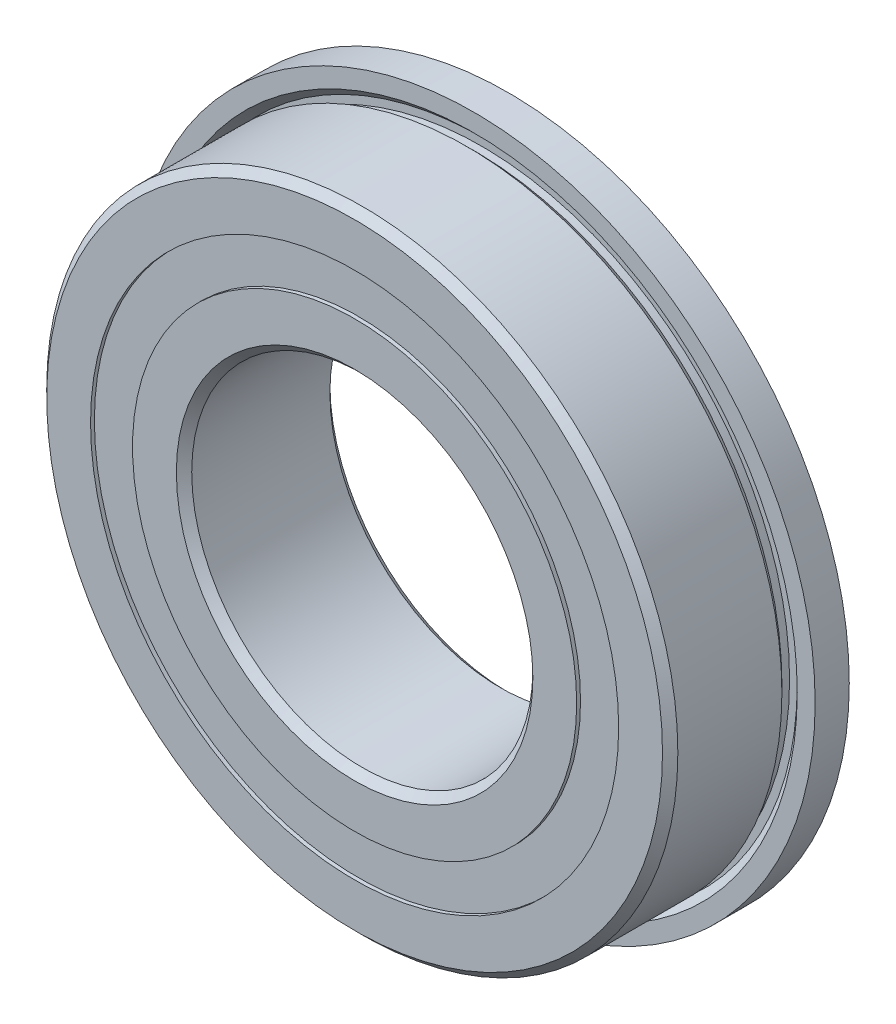
ISO-10303-21;
HEADER;
FILE_DESCRIPTION(('STEP AP214'),'2;1');
FILE_NAME('part.step','',(''),(''),'','','');
FILE_SCHEMA(('AUTOMOTIVE_DESIGN { 1 0 10303 214 1 1 1 1 }'));
ENDSEC;
DATA;
#1=APPLICATION_CONTEXT('core data for automotive mechanical design processes');
#2=APPLICATION_PROTOCOL_DEFINITION('international standard','automotive_design',2000,#1);
#3=PRODUCT_CONTEXT('',#1,'mechanical');
#4=PRODUCT('Part','Part','',(#3));
#5=PRODUCT_RELATED_PRODUCT_CATEGORY('part','',(#4));
#6=PRODUCT_DEFINITION_FORMATION('','',#4);
#7=PRODUCT_DEFINITION_CONTEXT('part definition',#1,'design');
#8=PRODUCT_DEFINITION('design','',#6,#7);
#9=PRODUCT_DEFINITION_SHAPE('','',#8);
#10=(LENGTH_UNIT() NAMED_UNIT(*) SI_UNIT(.MILLI.,.METRE.));
#11=(NAMED_UNIT(*) PLANE_ANGLE_UNIT() SI_UNIT($,.RADIAN.));
#12=(NAMED_UNIT(*) SI_UNIT($,.STERADIAN.) SOLID_ANGLE_UNIT());
#13=UNCERTAINTY_MEASURE_WITH_UNIT(LENGTH_MEASURE(1.E-05),#10,'distance_accuracy_value','');
#14=(GEOMETRIC_REPRESENTATION_CONTEXT(3) GLOBAL_UNCERTAINTY_ASSIGNED_CONTEXT((#13)) GLOBAL_UNIT_ASSIGNED_CONTEXT((#10,
#11,#12)) REPRESENTATION_CONTEXT('',''));
#15=CARTESIAN_POINT('',(0.,0.,0.));
#16=DIRECTION('',(0.,0.,1.));
#17=DIRECTION('',(1.,0.,0.));
#18=AXIS2_PLACEMENT_3D('',#15,#16,#17);
#19=CARTESIAN_POINT('',(0.,15.4807692307692,-4.275));
#20=DIRECTION('',(0.,0.,1.));
#21=DIRECTION('',(1.,0.,0.));
#22=AXIS2_PLACEMENT_3D('',#19,#20,#21);
#23=PLANE('',#22);
#24=CARTESIAN_POINT('',(0.,0.,-4.275));
#25=DIRECTION('',(0.,0.,1.));
#26=DIRECTION('',(1.,0.,0.));
#27=AXIS2_PLACEMENT_3D('',#24,#25,#26);
#28=CIRCLE('',#27,15.4807692307692);
#29=CARTESIAN_POINT('',(15.4807692307692,0.,-4.275));
#30=VERTEX_POINT('',#29);
#31=EDGE_CURVE('E57',#30,#30,#28,.T.);
#32=ORIENTED_EDGE('',*,*,#31,.F.);
#33=EDGE_LOOP('',(#32));
#34=FACE_BOUND('',#33,.T.);
#35=CARTESIAN_POINT('',(0.,0.,-4.275));
#36=DIRECTION('',(0.,0.,1.));
#37=DIRECTION('',(1.,0.,0.));
#38=AXIS2_PLACEMENT_3D('',#35,#36,#37);
#39=CIRCLE('',#38,13.0192307692308);
#40=CARTESIAN_POINT('',(13.0192307692308,0.,-4.275));
#41=VERTEX_POINT('',#40);
#42=EDGE_CURVE('E11',#41,#41,#39,.T.);
#43=ORIENTED_EDGE('',*,*,#42,.T.);
#44=EDGE_LOOP('',(#43));
#45=FACE_BOUND('',#44,.T.);
#46=ADVANCED_FACE('F43',(#34,#45),#23,.F.);
#47=CARTESIAN_POINT('',(0.,0.,4.5));
#48=DIRECTION('',(0.,0.,1.));
#49=DIRECTION('',(1.,0.,0.));
#50=AXIS2_PLACEMENT_3D('',#47,#48,#49);
#51=CYLINDRICAL_SURFACE('',#50,13.0192307692308);
#52=ORIENTED_EDGE('',*,*,#42,.F.);
#53=EDGE_LOOP('',(#52));
#54=FACE_BOUND('',#53,.T.);
#55=CARTESIAN_POINT('',(0.,0.,-2.34835961884211));
#56=DIRECTION('',(0.,0.,1.));
#57=DIRECTION('',(1.,0.,0.));
#58=AXIS2_PLACEMENT_3D('',#55,#56,#57);
#59=CIRCLE('',#58,13.0192307692308);
#60=CARTESIAN_POINT('',(13.0192307692308,0.,-2.34835961884211));
#61=VERTEX_POINT('',#60);
#62=EDGE_CURVE('E49',#61,#61,#59,.T.);
#63=ORIENTED_EDGE('',*,*,#62,.T.);
#64=EDGE_LOOP('',(#63));
#65=FACE_BOUND('',#64,.T.);
#66=ADVANCED_FACE('F66',(#54,#65),#51,.F.);
#67=CARTESIAN_POINT('',(0.,15.4807692307692,-2.34835961884211));
#68=DIRECTION('',(0.,0.,-1.));
#69=DIRECTION('',(-1.,0.,0.));
#70=AXIS2_PLACEMENT_3D('',#67,#68,#69);
#71=PLANE('',#70);
#72=ORIENTED_EDGE('',*,*,#62,.F.);
#73=EDGE_LOOP('',(#72));
#74=FACE_BOUND('',#73,.T.);
#75=CARTESIAN_POINT('',(0.,0.,-2.34835961884211));
#76=DIRECTION('',(0.,0.,1.));
#77=DIRECTION('',(1.,0.,0.));
#78=AXIS2_PLACEMENT_3D('',#75,#76,#77);
#79=CIRCLE('',#78,15.4807692307692);
#80=CARTESIAN_POINT('',(15.4807692307692,0.,-2.34835961884211));
#81=VERTEX_POINT('',#80);
#82=EDGE_CURVE('E53',#81,#81,#79,.T.);
#83=ORIENTED_EDGE('',*,*,#82,.T.);
#84=EDGE_LOOP('',(#83));
#85=FACE_BOUND('',#84,.T.);
#86=ADVANCED_FACE('F70',(#74,#85),#71,.F.);
#87=CARTESIAN_POINT('',(0.,0.,4.5));
#88=DIRECTION('',(0.,0.,1.));
#89=DIRECTION('',(1.,0.,0.));
#90=AXIS2_PLACEMENT_3D('',#87,#88,#89);
#91=CYLINDRICAL_SURFACE('',#90,15.4807692307692);
#92=ORIENTED_EDGE('',*,*,#82,.F.);
#93=EDGE_LOOP('',(#92));
#94=FACE_BOUND('',#93,.T.);
#95=ORIENTED_EDGE('',*,*,#31,.T.);
#96=EDGE_LOOP('',(#95));
#97=FACE_BOUND('',#96,.T.);
#98=ADVANCED_FACE('F63',(#94,#97),#91,.T.);
#99=CLOSED_SHELL('',(#46,#66,#86,#98));
#100=MANIFOLD_SOLID_BREP('B2',#99);
#101=CARTESIAN_POINT('',(0.,15.4807692307692,4.275));
#102=DIRECTION('',(0.,0.,-1.));
#103=DIRECTION('',(-1.,0.,0.));
#104=AXIS2_PLACEMENT_3D('',#101,#102,#103);
#105=PLANE('',#104);
#106=CARTESIAN_POINT('',(0.,0.,4.275));
#107=DIRECTION('',(0.,0.,1.));
#108=DIRECTION('',(1.,0.,0.));
#109=AXIS2_PLACEMENT_3D('',#106,#107,#108);
#110=CIRCLE('',#109,13.0192307692308);
#111=CARTESIAN_POINT('',(13.0192307692308,0.,4.275));
#112=VERTEX_POINT('',#111);
#113=EDGE_CURVE('E42',#112,#112,#110,.T.);
#114=ORIENTED_EDGE('',*,*,#113,.F.);
#115=EDGE_LOOP('',(#114));
#116=FACE_BOUND('',#115,.T.);
#117=CARTESIAN_POINT('',(0.,0.,4.275));
#118=DIRECTION('',(0.,0.,1.));
#119=DIRECTION('',(1.,0.,0.));
#120=AXIS2_PLACEMENT_3D('',#117,#118,#119);
#121=CIRCLE('',#120,15.4807692307692);
#122=CARTESIAN_POINT('',(15.4807692307692,0.,4.275));
#123=VERTEX_POINT('',#122);
#124=EDGE_CURVE('E124',#123,#123,#121,.T.);
#125=ORIENTED_EDGE('',*,*,#124,.T.);
#126=EDGE_LOOP('',(#125));
#127=FACE_BOUND('',#126,.T.);
#128=ADVANCED_FACE('F110',(#116,#127),#105,.F.);
#129=CARTESIAN_POINT('',(0.,0.,4.5));
#130=DIRECTION('',(0.,0.,1.));
#131=DIRECTION('',(1.,0.,0.));
#132=AXIS2_PLACEMENT_3D('',#129,#130,#131);
#133=CYLINDRICAL_SURFACE('',#132,13.0192307692308);
#134=CARTESIAN_POINT('',(0.,0.,2.34835961884211));
#135=DIRECTION('',(0.,0.,1.));
#136=DIRECTION('',(1.,0.,0.));
#137=AXIS2_PLACEMENT_3D('',#134,#135,#136);
#138=CIRCLE('',#137,13.0192307692308);
#139=CARTESIAN_POINT('',(13.0192307692308,0.,2.34835961884211));
#140=VERTEX_POINT('',#139);
#141=EDGE_CURVE('E116',#140,#140,#138,.T.);
#142=ORIENTED_EDGE('',*,*,#141,.F.);
#143=EDGE_LOOP('',(#142));
#144=FACE_BOUND('',#143,.T.);
#145=ORIENTED_EDGE('',*,*,#113,.T.);
#146=EDGE_LOOP('',(#145));
#147=FACE_BOUND('',#146,.T.);
#148=ADVANCED_FACE('F139',(#144,#147),#133,.F.);
#149=CARTESIAN_POINT('',(0.,15.4807692307692,2.34835961884211));
#150=DIRECTION('',(0.,0.,1.));
#151=DIRECTION('',(1.,0.,0.));
#152=AXIS2_PLACEMENT_3D('',#149,#150,#151);
#153=PLANE('',#152);
#154=CARTESIAN_POINT('',(0.,0.,2.34835961884211));
#155=DIRECTION('',(0.,0.,1.));
#156=DIRECTION('',(1.,0.,0.));
#157=AXIS2_PLACEMENT_3D('',#154,#155,#156);
#158=CIRCLE('',#157,15.4807692307692);
#159=CARTESIAN_POINT('',(15.4807692307692,0.,2.34835961884211));
#160=VERTEX_POINT('',#159);
#161=EDGE_CURVE('E120',#160,#160,#158,.T.);
#162=ORIENTED_EDGE('',*,*,#161,.F.);
#163=EDGE_LOOP('',(#162));
#164=FACE_BOUND('',#163,.T.);
#165=ORIENTED_EDGE('',*,*,#141,.T.);
#166=EDGE_LOOP('',(#165));
#167=FACE_BOUND('',#166,.T.);
#168=ADVANCED_FACE('F134',(#164,#167),#153,.F.);
#169=CARTESIAN_POINT('',(0.,0.,4.5));
#170=DIRECTION('',(0.,0.,1.));
#171=DIRECTION('',(1.,0.,0.));
#172=AXIS2_PLACEMENT_3D('',#169,#170,#171);
#173=CYLINDRICAL_SURFACE('',#172,15.4807692307692);
#174=ORIENTED_EDGE('',*,*,#124,.F.);
#175=EDGE_LOOP('',(#174));
#176=FACE_BOUND('',#175,.T.);
#177=ORIENTED_EDGE('',*,*,#161,.T.);
#178=EDGE_LOOP('',(#177));
#179=FACE_BOUND('',#178,.T.);
#180=ADVANCED_FACE('F131',(#176,#179),#173,.T.);
#181=CLOSED_SHELL('',(#128,#148,#168,#180));
#182=MANIFOLD_SOLID_BREP('B6',#181);
#183=CARTESIAN_POINT('',(-7.70413164874212,11.9878628428444,0.));
#184=DIRECTION('',(0.,0.,1.));
#185=DIRECTION('',(-0.540640817455587,0.841253532831188,0.));
#186=AXIS2_PLACEMENT_3D('',#183,#184,#185);
#187=SPHERICAL_SURFACE('',#186,2.34835961884211);
#188=CARTESIAN_POINT('',(-7.70413164874212,11.9878628428444,2.34835961884211));
#189=VERTEX_POINT('',#188);
#190=VERTEX_LOOP('',#189);
#191=FACE_BOUND('',#190,.T.);
#192=ADVANCED_FACE('F177',(#191),#187,.T.);
#193=CLOSED_SHELL('',(#192));
#194=MANIFOLD_SOLID_BREP('B37',#193);
#195=CARTESIAN_POINT('',(-12.9622559338018,5.91966393527703,0.));
#196=DIRECTION('',(0.,0.,1.));
#197=DIRECTION('',(-0.909631995354514,0.415415013001897,0.));
#198=AXIS2_PLACEMENT_3D('',#195,#196,#197);
#199=SPHERICAL_SURFACE('',#198,2.34835961884211);
#200=CARTESIAN_POINT('',(-12.9622559338018,5.91966393527703,2.34835961884211));
#201=VERTEX_POINT('',#200);
#202=VERTEX_LOOP('',#201);
#203=FACE_BOUND('',#202,.T.);
#204=ADVANCED_FACE('F197',(#203),#199,.T.);
#205=CLOSED_SHELL('',(#204));
#206=MANIFOLD_SOLID_BREP('B106',#205);
#207=CARTESIAN_POINT('',(-14.1049555468033,-2.02798644539418,0.));
#208=DIRECTION('',(0.,0.,1.));
#209=DIRECTION('',(-0.989821441880934,-0.142314838273276,0.));
#210=AXIS2_PLACEMENT_3D('',#207,#208,#209);
#211=SPHERICAL_SURFACE('',#210,2.34835961884211);
#212=CARTESIAN_POINT('',(-14.1049555468033,-2.02798644539418,2.34835961884211));
#213=VERTEX_POINT('',#212);
#214=VERTEX_LOOP('',#213);
#215=FACE_BOUND('',#214,.T.);
#216=ADVANCED_FACE('F217',(#215),#211,.T.);
#217=CLOSED_SHELL('',(#216));
#218=MANIFOLD_SOLID_BREP('B173',#217);
#219=CARTESIAN_POINT('',(-10.7694314345483,-9.33176545872022,0.));
#220=DIRECTION('',(0.,0.,1.));
#221=DIRECTION('',(-0.755749574354264,-0.654860733945279,0.));
#222=AXIS2_PLACEMENT_3D('',#219,#220,#221);
#223=SPHERICAL_SURFACE('',#222,2.34835961884211);
#224=CARTESIAN_POINT('',(-10.7694314345483,-9.33176545872022,2.34835961884211));
#225=VERTEX_POINT('',#224);
#226=VERTEX_LOOP('',#225);
#227=FACE_BOUND('',#226,.T.);
#228=ADVANCED_FACE('F237',(#227),#223,.T.);
#229=CLOSED_SHELL('',(#228));
#230=MANIFOLD_SOLID_BREP('B193',#229);
#231=CARTESIAN_POINT('',(-4.01468893499047,-13.6727748740066,0.));
#232=DIRECTION('',(0.,0.,1.));
#233=DIRECTION('',(-0.281732556841437,-0.959492973614495,0.));
#234=AXIS2_PLACEMENT_3D('',#231,#232,#233);
#235=SPHERICAL_SURFACE('',#234,2.34835961884211);
#236=CARTESIAN_POINT('',(-4.01468893499047,-13.6727748740066,2.34835961884211));
#237=VERTEX_POINT('',#236);
#238=VERTEX_LOOP('',#237);
#239=FACE_BOUND('',#238,.T.);
#240=ADVANCED_FACE('F257',(#239),#235,.T.);
#241=CLOSED_SHELL('',(#240));
#242=MANIFOLD_SOLID_BREP('B213',#241);
#243=CARTESIAN_POINT('',(4.01468893499029,-13.6727748740066,0.));
#244=DIRECTION('',(0.,0.,1.));
#245=DIRECTION('',(0.281732556841424,-0.959492973614499,0.));
#246=AXIS2_PLACEMENT_3D('',#243,#244,#245);
#247=SPHERICAL_SURFACE('',#246,2.34835961884211);
#248=CARTESIAN_POINT('',(4.01468893499029,-13.6727748740066,2.34835961884211));
#249=VERTEX_POINT('',#248);
#250=VERTEX_LOOP('',#249);
#251=FACE_BOUND('',#250,.T.);
#252=ADVANCED_FACE('F277',(#251),#247,.T.);
#253=CLOSED_SHELL('',(#252));
#254=MANIFOLD_SOLID_BREP('B233',#253);
#255=CARTESIAN_POINT('',(10.7694314345481,-9.33176545872037,0.));
#256=DIRECTION('',(0.,0.,1.));
#257=DIRECTION('',(0.755749574354255,-0.654860733945289,0.));
#258=AXIS2_PLACEMENT_3D('',#255,#256,#257);
#259=SPHERICAL_SURFACE('',#258,2.34835961884211);
#260=CARTESIAN_POINT('',(10.7694314345481,-9.33176545872037,2.34835961884211));
#261=VERTEX_POINT('',#260);
#262=VERTEX_LOOP('',#261);
#263=FACE_BOUND('',#262,.T.);
#264=ADVANCED_FACE('F297',(#263),#259,.T.);
#265=CLOSED_SHELL('',(#264));
#266=MANIFOLD_SOLID_BREP('B253',#265);
#267=CARTESIAN_POINT('',(14.1049555468033,-2.02798644539436,0.));
#268=DIRECTION('',(0.,0.,1.));
#269=DIRECTION('',(0.989821441880932,-0.142314838273289,0.));
#270=AXIS2_PLACEMENT_3D('',#267,#268,#269);
#271=SPHERICAL_SURFACE('',#270,2.34835961884211);
#272=CARTESIAN_POINT('',(14.1049555468033,-2.02798644539436,2.34835961884211));
#273=VERTEX_POINT('',#272);
#274=VERTEX_LOOP('',#273);
#275=FACE_BOUND('',#274,.T.);
#276=ADVANCED_FACE('F317',(#275),#271,.T.);
#277=CLOSED_SHELL('',(#276));
#278=MANIFOLD_SOLID_BREP('B273',#277);
#279=CARTESIAN_POINT('',(12.9622559338019,5.91966393527685,0.));
#280=DIRECTION('',(0.,0.,1.));
#281=DIRECTION('',(0.90963199535452,0.415415013001884,0.));
#282=AXIS2_PLACEMENT_3D('',#279,#280,#281);
#283=SPHERICAL_SURFACE('',#282,2.34835961884211);
#284=CARTESIAN_POINT('',(12.9622559338019,5.91966393527685,2.34835961884211));
#285=VERTEX_POINT('',#284);
#286=VERTEX_LOOP('',#285);
#287=FACE_BOUND('',#286,.T.);
#288=ADVANCED_FACE('F337',(#287),#283,.T.);
#289=CLOSED_SHELL('',(#288));
#290=MANIFOLD_SOLID_BREP('B293',#289);
#291=CARTESIAN_POINT('',(7.70413164874228,11.9878628428443,0.));
#292=DIRECTION('',(0.,0.,1.));
#293=DIRECTION('',(0.540640817455599,0.841253532831181,0.));
#294=AXIS2_PLACEMENT_3D('',#291,#292,#293);
#295=SPHERICAL_SURFACE('',#294,2.34835961884211);
#296=CARTESIAN_POINT('',(7.70413164874228,11.9878628428443,2.34835961884211));
#297=VERTEX_POINT('',#296);
#298=VERTEX_LOOP('',#297);
#299=FACE_BOUND('',#298,.T.);
#300=ADVANCED_FACE('F357',(#299),#295,.T.);
#301=CLOSED_SHELL('',(#300));
#302=MANIFOLD_SOLID_BREP('B313',#301);
#303=CARTESIAN_POINT('',(0.,14.25,0.));
#304=DIRECTION('',(0.,0.,1.));
#305=DIRECTION('',(0.,1.,0.));
#306=AXIS2_PLACEMENT_3D('',#303,#304,#305);
#307=SPHERICAL_SURFACE('',#306,2.34835961884211);
#308=CARTESIAN_POINT('',(0.,14.25,2.34835961884211));
#309=VERTEX_POINT('',#308);
#310=VERTEX_LOOP('',#309);
#311=FACE_BOUND('',#310,.T.);
#312=ADVANCED_FACE('F379',(#311),#307,.T.);
#313=CLOSED_SHELL('',(#312));
#314=MANIFOLD_SOLID_BREP('B333',#313);
#315=CARTESIAN_POINT('',(0.,14.8653846153846,0.205128205128205));
#316=DIRECTION('',(0.,0.,-1.));
#317=DIRECTION('',(-1.,0.,0.));
#318=AXIS2_PLACEMENT_3D('',#315,#316,#317);
#319=PLANE('',#318);
#320=CARTESIAN_POINT('',(0.,0.,0.205128205128205));
#321=DIRECTION('',(0.,0.,1.));
#322=DIRECTION('',(1.,0.,0.));
#323=AXIS2_PLACEMENT_3D('',#320,#321,#322);
#324=CIRCLE('',#323,13.6346153846154);
#325=CARTESIAN_POINT('',(13.6346153846154,0.,0.205128205128205));
#326=VERTEX_POINT('',#325);
#327=EDGE_CURVE('E378',#326,#326,#324,.T.);
#328=ORIENTED_EDGE('',*,*,#327,.F.);
#329=EDGE_LOOP('',(#328));
#330=FACE_BOUND('',#329,.T.);
#331=CARTESIAN_POINT('',(0.,0.,0.205128205128205));
#332=DIRECTION('',(0.,0.,1.));
#333=DIRECTION('',(1.,0.,0.));
#334=AXIS2_PLACEMENT_3D('',#331,#332,#333);
#335=CIRCLE('',#334,14.8653846153846);
#336=CARTESIAN_POINT('',(14.8653846153846,0.,0.205128205128205));
#337=VERTEX_POINT('',#336);
#338=EDGE_CURVE('E413',#337,#337,#335,.T.);
#339=ORIENTED_EDGE('',*,*,#338,.T.);
#340=EDGE_LOOP('',(#339));
#341=FACE_BOUND('',#340,.T.);
#342=ADVANCED_FACE('F399',(#330,#341),#319,.F.);
#343=CARTESIAN_POINT('',(0.,0.,4.5));
#344=DIRECTION('',(0.,0.,1.));
#345=DIRECTION('',(1.,0.,0.));
#346=AXIS2_PLACEMENT_3D('',#343,#344,#345);
#347=CYLINDRICAL_SURFACE('',#346,13.6346153846154);
#348=CARTESIAN_POINT('',(0.,0.,-0.205128205128206));
#349=DIRECTION('',(0.,0.,1.));
#350=DIRECTION('',(1.,0.,0.));
#351=AXIS2_PLACEMENT_3D('',#348,#349,#350);
#352=CIRCLE('',#351,13.6346153846154);
#353=CARTESIAN_POINT('',(13.6346153846154,0.,-0.205128205128206));
#354=VERTEX_POINT('',#353);
#355=EDGE_CURVE('E405',#354,#354,#352,.T.);
#356=ORIENTED_EDGE('',*,*,#355,.F.);
#357=EDGE_LOOP('',(#356));
#358=FACE_BOUND('',#357,.T.);
#359=ORIENTED_EDGE('',*,*,#327,.T.);
#360=EDGE_LOOP('',(#359));
#361=FACE_BOUND('',#360,.T.);
#362=ADVANCED_FACE('F428',(#358,#361),#347,.F.);
#363=CARTESIAN_POINT('',(0.,14.8653846153846,-0.205128205128205));
#364=DIRECTION('',(0.,0.,1.));
#365=DIRECTION('',(1.,0.,0.));
#366=AXIS2_PLACEMENT_3D('',#363,#364,#365);
#367=PLANE('',#366);
#368=CARTESIAN_POINT('',(0.,0.,-0.205128205128205));
#369=DIRECTION('',(0.,0.,1.));
#370=DIRECTION('',(1.,0.,0.));
#371=AXIS2_PLACEMENT_3D('',#368,#369,#370);
#372=CIRCLE('',#371,14.8653846153846);
#373=CARTESIAN_POINT('',(14.8653846153846,0.,-0.205128205128205));
#374=VERTEX_POINT('',#373);
#375=EDGE_CURVE('E409',#374,#374,#372,.T.);
#376=ORIENTED_EDGE('',*,*,#375,.F.);
#377=EDGE_LOOP('',(#376));
#378=FACE_BOUND('',#377,.T.);
#379=ORIENTED_EDGE('',*,*,#355,.T.);
#380=EDGE_LOOP('',(#379));
#381=FACE_BOUND('',#380,.T.);
#382=ADVANCED_FACE('F423',(#378,#381),#367,.F.);
#383=CARTESIAN_POINT('',(0.,0.,4.5));
#384=DIRECTION('',(0.,0.,1.));
#385=DIRECTION('',(1.,0.,0.));
#386=AXIS2_PLACEMENT_3D('',#383,#384,#385);
#387=CYLINDRICAL_SURFACE('',#386,14.8653846153846);
#388=ORIENTED_EDGE('',*,*,#338,.F.);
#389=EDGE_LOOP('',(#388));
#390=FACE_BOUND('',#389,.T.);
#391=ORIENTED_EDGE('',*,*,#375,.T.);
#392=EDGE_LOOP('',(#391));
#393=FACE_BOUND('',#392,.T.);
#394=ADVANCED_FACE('F420',(#390,#393),#387,.T.);
#395=CLOSED_SHELL('',(#342,#362,#382,#394));
#396=MANIFOLD_SOLID_BREP('B353',#395);
#397=CARTESIAN_POINT('',(0.,13.0192307692308,4.50000000000001));
#398=DIRECTION('',(0.,0.,-1.));
#399=DIRECTION('',(-1.,0.,0.));
#400=AXIS2_PLACEMENT_3D('',#397,#398,#399);
#401=PLANE('',#400);
#402=CARTESIAN_POINT('',(0.,0.,4.50000000000001));
#403=DIRECTION('',(0.,0.,1.));
#404=DIRECTION('',(1.,0.,0.));
#405=AXIS2_PLACEMENT_3D('',#402,#403,#404);
#406=CIRCLE('',#405,10.45);
#407=CARTESIAN_POINT('',(10.45,0.,4.50000000000001));
#408=VERTEX_POINT('',#407);
#409=EDGE_CURVE('E495',#408,#408,#406,.T.);
#410=ORIENTED_EDGE('',*,*,#409,.F.);
#411=EDGE_LOOP('',(#410));
#412=FACE_BOUND('',#411,.T.);
#413=CARTESIAN_POINT('',(0.,0.,4.50000000000001));
#414=DIRECTION('',(0.,0.,1.));
#415=DIRECTION('',(1.,0.,0.));
#416=AXIS2_PLACEMENT_3D('',#413,#414,#415);
#417=CIRCLE('',#416,13.0192307692308);
#418=CARTESIAN_POINT('',(13.0192307692308,0.,4.50000000000001));
#419=VERTEX_POINT('',#418);
#420=EDGE_CURVE('E398',#419,#419,#417,.T.);
#421=ORIENTED_EDGE('',*,*,#420,.T.);
#422=EDGE_LOOP('',(#421));
#423=FACE_BOUND('',#422,.T.);
#424=ADVANCED_FACE('F467',(#412,#423),#401,.F.);
#425=CARTESIAN_POINT('',(0.,0.,4.5));
#426=DIRECTION('',(0.,0.,1.));
#427=DIRECTION('',(1.,0.,0.));
#428=AXIS2_PLACEMENT_3D('',#425,#426,#427);
#429=CYLINDRICAL_SURFACE('',#428,13.0192307692308);
#430=ORIENTED_EDGE('',*,*,#420,.F.);
#431=EDGE_LOOP('',(#430));
#432=FACE_BOUND('',#431,.T.);
#433=CARTESIAN_POINT('',(0.,0.,2.));
#434=DIRECTION('',(0.,0.,1.));
#435=DIRECTION('',(1.,0.,0.));
#436=AXIS2_PLACEMENT_3D('',#433,#434,#435);
#437=CIRCLE('',#436,13.0192307692308);
#438=CARTESIAN_POINT('',(13.0192307692308,0.,2.));
#439=VERTEX_POINT('',#438);
#440=EDGE_CURVE('E473',#439,#439,#437,.T.);
#441=ORIENTED_EDGE('',*,*,#440,.T.);
#442=EDGE_LOOP('',(#441));
#443=FACE_BOUND('',#442,.T.);
#444=ADVANCED_FACE('F502',(#432,#443),#429,.T.);
#445=CARTESIAN_POINT('',(0.,0.,0.));
#446=DIRECTION('',(0.,0.,1.));
#447=DIRECTION('',(1.,0.,0.));
#448=AXIS2_PLACEMENT_3D('',#445,#446,#447);
#449=TOROIDAL_SURFACE('',#448,14.25,2.34835961884211);
#450=ORIENTED_EDGE('',*,*,#440,.F.);
#451=EDGE_LOOP('',(#450));
#452=FACE_BOUND('',#451,.T.);
#453=CARTESIAN_POINT('',(0.,0.,-2.));
#454=DIRECTION('',(0.,0.,1.));
#455=DIRECTION('',(1.,0.,0.));
#456=AXIS2_PLACEMENT_3D('',#453,#454,#455);
#457=CIRCLE('',#456,13.0192307692308);
#458=CARTESIAN_POINT('',(13.0192307692308,0.,-2.));
#459=VERTEX_POINT('',#458);
#460=EDGE_CURVE('E477',#459,#459,#457,.T.);
#461=ORIENTED_EDGE('',*,*,#460,.T.);
#462=EDGE_LOOP('',(#461));
#463=FACE_BOUND('',#462,.T.);
#464=ADVANCED_FACE('F506',(#452,#463),#449,.F.);
#465=CARTESIAN_POINT('',(0.,0.,4.5));
#466=DIRECTION('',(0.,0.,1.));
#467=DIRECTION('',(1.,0.,0.));
#468=AXIS2_PLACEMENT_3D('',#465,#466,#467);
#469=CYLINDRICAL_SURFACE('',#468,13.0192307692308);
#470=ORIENTED_EDGE('',*,*,#460,.F.);
#471=EDGE_LOOP('',(#470));
#472=FACE_BOUND('',#471,.T.);
#473=CARTESIAN_POINT('',(0.,0.,-4.50000000000001));
#474=DIRECTION('',(0.,0.,1.));
#475=DIRECTION('',(1.,0.,0.));
#476=AXIS2_PLACEMENT_3D('',#473,#474,#475);
#477=CIRCLE('',#476,13.0192307692308);
#478=CARTESIAN_POINT('',(13.0192307692308,0.,-4.50000000000001));
#479=VERTEX_POINT('',#478);
#480=EDGE_CURVE('E481',#479,#479,#477,.T.);
#481=ORIENTED_EDGE('',*,*,#480,.T.);
#482=EDGE_LOOP('',(#481));
#483=FACE_BOUND('',#482,.T.);
#484=ADVANCED_FACE('F511',(#472,#483),#469,.T.);
#485=CARTESIAN_POINT('',(0.,10.45,-4.50000000000001));
#486=DIRECTION('',(0.,0.,1.));
#487=DIRECTION('',(1.,0.,0.));
#488=AXIS2_PLACEMENT_3D('',#485,#486,#487);
#489=PLANE('',#488);
#490=ORIENTED_EDGE('',*,*,#480,.F.);
#491=EDGE_LOOP('',(#490));
#492=FACE_BOUND('',#491,.T.);
#493=CARTESIAN_POINT('',(0.,0.,-4.50000000000001));
#494=DIRECTION('',(0.,0.,1.));
#495=DIRECTION('',(1.,0.,0.));
#496=AXIS2_PLACEMENT_3D('',#493,#494,#495);
#497=CIRCLE('',#496,10.45);
#498=CARTESIAN_POINT('',(10.45,0.,-4.50000000000001));
#499=VERTEX_POINT('',#498);
#500=EDGE_CURVE('E486',#499,#499,#497,.T.);
#501=ORIENTED_EDGE('',*,*,#500,.T.);
#502=EDGE_LOOP('',(#501));
#503=FACE_BOUND('',#502,.T.);
#504=ADVANCED_FACE('F517',(#492,#503),#489,.F.);
#505=CARTESIAN_POINT('',(0.,0.,-4.04999999999999));
#506=DIRECTION('',(0.,0.,-1.));
#507=DIRECTION('',(-1.,0.,0.));
#508=AXIS2_PLACEMENT_3D('',#505,#506,#507);
#509=CONICAL_SURFACE('',#508,10.,0.785398163397441);
#510=ORIENTED_EDGE('',*,*,#500,.F.);
#511=EDGE_LOOP('',(#510));
#512=FACE_BOUND('',#511,.T.);
#513=CARTESIAN_POINT('',(0.,0.,-4.04999999999999));
#514=DIRECTION('',(0.,0.,1.));
#515=DIRECTION('',(1.,0.,0.));
#516=AXIS2_PLACEMENT_3D('',#513,#514,#515);
#517=CIRCLE('',#516,10.);
#518=CARTESIAN_POINT('',(10.,0.,-4.04999999999999));
#519=VERTEX_POINT('',#518);
#520=EDGE_CURVE('E489',#519,#519,#517,.T.);
#521=ORIENTED_EDGE('',*,*,#520,.T.);
#522=EDGE_LOOP('',(#521));
#523=FACE_BOUND('',#522,.T.);
#524=ADVANCED_FACE('F521',(#512,#523),#509,.F.);
#525=CARTESIAN_POINT('',(0.,0.,4.5));
#526=DIRECTION('',(0.,0.,1.));
#527=DIRECTION('',(1.,0.,0.));
#528=AXIS2_PLACEMENT_3D('',#525,#526,#527);
#529=CYLINDRICAL_SURFACE('',#528,10.);
#530=ORIENTED_EDGE('',*,*,#520,.F.);
#531=EDGE_LOOP('',(#530));
#532=FACE_BOUND('',#531,.T.);
#533=CARTESIAN_POINT('',(0.,0.,4.05));
#534=DIRECTION('',(0.,0.,1.));
#535=DIRECTION('',(1.,0.,0.));
#536=AXIS2_PLACEMENT_3D('',#533,#534,#535);
#537=CIRCLE('',#536,10.);
#538=CARTESIAN_POINT('',(10.,0.,4.05));
#539=VERTEX_POINT('',#538);
#540=EDGE_CURVE('E492',#539,#539,#537,.T.);
#541=ORIENTED_EDGE('',*,*,#540,.T.);
#542=EDGE_LOOP('',(#541));
#543=FACE_BOUND('',#542,.T.);
#544=ADVANCED_FACE('F525',(#532,#543),#529,.F.);
#545=CARTESIAN_POINT('',(0.,0.,4.50000000000001));
#546=DIRECTION('',(0.,0.,1.));
#547=DIRECTION('',(1.,0.,0.));
#548=AXIS2_PLACEMENT_3D('',#545,#546,#547);
#549=CONICAL_SURFACE('',#548,10.45,0.785398163397454);
#550=ORIENTED_EDGE('',*,*,#540,.F.);
#551=EDGE_LOOP('',(#550));
#552=FACE_BOUND('',#551,.T.);
#553=ORIENTED_EDGE('',*,*,#409,.T.);
#554=EDGE_LOOP('',(#553));
#555=FACE_BOUND('',#554,.T.);
#556=ADVANCED_FACE('F499',(#552,#555),#549,.F.);
#557=CLOSED_SHELL('',(#424,#444,#464,#484,#504,#524,#544,#556));
#558=MANIFOLD_SOLID_BREP('B373',#557);
#559=CARTESIAN_POINT('',(0.,0.,4.5));
#560=DIRECTION('',(0.,0.,1.));
#561=DIRECTION('',(1.,0.,0.));
#562=AXIS2_PLACEMENT_3D('',#559,#560,#561);
#563=CYLINDRICAL_SURFACE('',#562,20.);
#564=CARTESIAN_POINT('',(0.,0.,-2.5));
#565=DIRECTION('',(0.,0.,1.));
#566=DIRECTION('',(1.,0.,0.));
#567=AXIS2_PLACEMENT_3D('',#564,#565,#566);
#568=CIRCLE('',#567,20.);
#569=CARTESIAN_POINT('',(20.,0.,-2.5));
#570=VERTEX_POINT('',#569);
#571=EDGE_CURVE('E594',#570,#570,#568,.T.);
#572=ORIENTED_EDGE('',*,*,#571,.F.);
#573=EDGE_LOOP('',(#572));
#574=FACE_BOUND('',#573,.T.);
#575=CARTESIAN_POINT('',(0.,0.,-4.49999999999999));
#576=DIRECTION('',(0.,0.,1.));
#577=DIRECTION('',(1.,0.,0.));
#578=AXIS2_PLACEMENT_3D('',#575,#576,#577);
#579=CIRCLE('',#578,20.);
#580=CARTESIAN_POINT('',(20.,0.,-4.49999999999999));
#581=VERTEX_POINT('',#580);
#582=EDGE_CURVE('E466',#581,#581,#579,.T.);
#583=ORIENTED_EDGE('',*,*,#582,.T.);
#584=EDGE_LOOP('',(#583));
#585=FACE_BOUND('',#584,.T.);
#586=ADVANCED_FACE('F588',(#574,#585),#563,.T.);
#587=CARTESIAN_POINT('',(0.,20.,-2.5));
#588=DIRECTION('',(0.,0.,-1.));
#589=DIRECTION('',(-1.,0.,0.));
#590=AXIS2_PLACEMENT_3D('',#587,#588,#589);
#591=PLANE('',#590);
#592=CARTESIAN_POINT('',(0.,0.,-2.5));
#593=DIRECTION('',(0.,0.,1.));
#594=DIRECTION('',(1.,0.,0.));
#595=AXIS2_PLACEMENT_3D('',#592,#593,#594);
#596=CIRCLE('',#595,18.95);
#597=CARTESIAN_POINT('',(18.95,0.,-2.5));
#598=VERTEX_POINT('',#597);
#599=EDGE_CURVE('E598',#598,#598,#596,.T.);
#600=ORIENTED_EDGE('',*,*,#599,.F.);
#601=EDGE_LOOP('',(#600));
#602=FACE_BOUND('',#601,.T.);
#603=ORIENTED_EDGE('',*,*,#571,.T.);
#604=EDGE_LOOP('',(#603));
#605=FACE_BOUND('',#604,.T.);
#606=ADVANCED_FACE('F694',(#602,#605),#591,.F.);
#607=CARTESIAN_POINT('',(0.,0.,-2.5));
#608=DIRECTION('',(0.,0.,1.));
#609=DIRECTION('',(1.,0.,0.));
#610=AXIS2_PLACEMENT_3D('',#607,#608,#609);
#611=CONICAL_SURFACE('',#610,18.95,0.785398163397461);
#612=CARTESIAN_POINT('',(0.,0.,-2.95000000000001));
#613=DIRECTION('',(0.,0.,1.));
#614=DIRECTION('',(1.,0.,0.));
#615=AXIS2_PLACEMENT_3D('',#612,#613,#614);
#616=CIRCLE('',#615,18.5);
#617=CARTESIAN_POINT('',(18.5,0.,-2.95000000000001));
#618=VERTEX_POINT('',#617);
#619=EDGE_CURVE('E602',#618,#618,#616,.T.);
#620=ORIENTED_EDGE('',*,*,#619,.F.);
#621=EDGE_LOOP('',(#620));
#622=FACE_BOUND('',#621,.T.);
#623=ORIENTED_EDGE('',*,*,#599,.T.);
#624=EDGE_LOOP('',(#623));
#625=FACE_BOUND('',#624,.T.);
#626=ADVANCED_FACE('F688',(#622,#625),#611,.F.);
#627=CARTESIAN_POINT('',(0.,18.5,-2.95000000000001));
#628=DIRECTION('',(0.,0.,-1.));
#629=DIRECTION('',(-1.,0.,0.));
#630=AXIS2_PLACEMENT_3D('',#627,#628,#629);
#631=PLANE('',#630);
#632=CARTESIAN_POINT('',(0.,0.,-2.95000000000001));
#633=DIRECTION('',(0.,0.,1.));
#634=DIRECTION('',(1.,0.,0.));
#635=AXIS2_PLACEMENT_3D('',#632,#633,#634);
#636=CIRCLE('',#635,18.05);
#637=CARTESIAN_POINT('',(18.05,0.,-2.95000000000001));
#638=VERTEX_POINT('',#637);
#639=EDGE_CURVE('E607',#638,#638,#636,.T.);
#640=ORIENTED_EDGE('',*,*,#639,.F.);
#641=EDGE_LOOP('',(#640));
#642=FACE_BOUND('',#641,.T.);
#643=ORIENTED_EDGE('',*,*,#619,.T.);
#644=EDGE_LOOP('',(#643));
#645=FACE_BOUND('',#644,.T.);
#646=ADVANCED_FACE('F682',(#642,#645),#631,.F.);
#647=CARTESIAN_POINT('',(0.,0.,4.5));
#648=DIRECTION('',(0.,0.,1.));
#649=DIRECTION('',(1.,0.,0.));
#650=AXIS2_PLACEMENT_3D('',#647,#648,#649);
#651=CYLINDRICAL_SURFACE('',#650,18.05);
#652=CARTESIAN_POINT('',(0.,0.,-2.5));
#653=DIRECTION('',(0.,0.,1.));
#654=DIRECTION('',(1.,0.,0.));
#655=AXIS2_PLACEMENT_3D('',#652,#653,#654);
#656=CIRCLE('',#655,18.05);
#657=CARTESIAN_POINT('',(18.05,0.,-2.5));
#658=VERTEX_POINT('',#657);
#659=EDGE_CURVE('E610',#658,#658,#656,.T.);
#660=ORIENTED_EDGE('',*,*,#659,.F.);
#661=EDGE_LOOP('',(#660));
#662=FACE_BOUND('',#661,.T.);
#663=ORIENTED_EDGE('',*,*,#639,.T.);
#664=EDGE_LOOP('',(#663));
#665=FACE_BOUND('',#664,.T.);
#666=ADVANCED_FACE('F676',(#662,#665),#651,.T.);
#667=CARTESIAN_POINT('',(0.,0.,-2.5));
#668=DIRECTION('',(0.,0.,1.));
#669=DIRECTION('',(1.,0.,0.));
#670=AXIS2_PLACEMENT_3D('',#667,#668,#669);
#671=CONICAL_SURFACE('',#670,18.05,0.785398163397448);
#672=CARTESIAN_POINT('',(0.,0.,-2.04999999999998));
#673=DIRECTION('',(0.,0.,1.));
#674=DIRECTION('',(1.,0.,0.));
#675=AXIS2_PLACEMENT_3D('',#672,#673,#674);
#676=CIRCLE('',#675,18.5);
#677=CARTESIAN_POINT('',(18.5,0.,-2.04999999999998));
#678=VERTEX_POINT('',#677);
#679=EDGE_CURVE('E613',#678,#678,#676,.T.);
#680=ORIENTED_EDGE('',*,*,#679,.F.);
#681=EDGE_LOOP('',(#680));
#682=FACE_BOUND('',#681,.T.);
#683=ORIENTED_EDGE('',*,*,#659,.T.);
#684=EDGE_LOOP('',(#683));
#685=FACE_BOUND('',#684,.T.);
#686=ADVANCED_FACE('F670',(#682,#685),#671,.T.);
#687=CARTESIAN_POINT('',(0.,0.,4.5));
#688=DIRECTION('',(0.,0.,1.));
#689=DIRECTION('',(1.,0.,0.));
#690=AXIS2_PLACEMENT_3D('',#687,#688,#689);
#691=CYLINDRICAL_SURFACE('',#690,18.5);
#692=CARTESIAN_POINT('',(0.,0.,4.04999999999999));
#693=DIRECTION('',(0.,0.,1.));
#694=DIRECTION('',(1.,0.,0.));
#695=AXIS2_PLACEMENT_3D('',#692,#693,#694);
#696=CIRCLE('',#695,18.5);
#697=CARTESIAN_POINT('',(18.5,0.,4.04999999999999));
#698=VERTEX_POINT('',#697);
#699=EDGE_CURVE('E616',#698,#698,#696,.T.);
#700=ORIENTED_EDGE('',*,*,#699,.F.);
#701=EDGE_LOOP('',(#700));
#702=FACE_BOUND('',#701,.T.);
#703=ORIENTED_EDGE('',*,*,#679,.T.);
#704=EDGE_LOOP('',(#703));
#705=FACE_BOUND('',#704,.T.);
#706=ADVANCED_FACE('F664',(#702,#705),#691,.T.);
#707=CARTESIAN_POINT('',(0.,0.,4.04999999999999));
#708=DIRECTION('',(0.,0.,-1.));
#709=DIRECTION('',(-1.,0.,0.));
#710=AXIS2_PLACEMENT_3D('',#707,#708,#709);
#711=CONICAL_SURFACE('',#710,18.5,0.785398163397443);
#712=CARTESIAN_POINT('',(0.,0.,4.50000000000001));
#713=DIRECTION('',(0.,0.,1.));
#714=DIRECTION('',(1.,0.,0.));
#715=AXIS2_PLACEMENT_3D('',#712,#713,#714);
#716=CIRCLE('',#715,18.05);
#717=CARTESIAN_POINT('',(18.05,0.,4.50000000000001));
#718=VERTEX_POINT('',#717);
#719=EDGE_CURVE('E619',#718,#718,#716,.T.);
#720=ORIENTED_EDGE('',*,*,#719,.F.);
#721=EDGE_LOOP('',(#720));
#722=FACE_BOUND('',#721,.T.);
#723=ORIENTED_EDGE('',*,*,#699,.T.);
#724=EDGE_LOOP('',(#723));
#725=FACE_BOUND('',#724,.T.);
#726=ADVANCED_FACE('F658',(#722,#725),#711,.T.);
#727=CARTESIAN_POINT('',(0.,18.05,4.5));
#728=DIRECTION('',(0.,0.,-1.));
#729=DIRECTION('',(-1.,0.,0.));
#730=AXIS2_PLACEMENT_3D('',#727,#728,#729);
#731=PLANE('',#730);
#732=CARTESIAN_POINT('',(0.,0.,4.5));
#733=DIRECTION('',(0.,0.,1.));
#734=DIRECTION('',(1.,0.,0.));
#735=AXIS2_PLACEMENT_3D('',#732,#733,#734);
#736=CIRCLE('',#735,15.4807692307692);
#737=CARTESIAN_POINT('',(15.4807692307692,0.,4.5));
#738=VERTEX_POINT('',#737);
#739=EDGE_CURVE('E622',#738,#738,#736,.T.);
#740=ORIENTED_EDGE('',*,*,#739,.F.);
#741=EDGE_LOOP('',(#740));
#742=FACE_BOUND('',#741,.T.);
#743=ORIENTED_EDGE('',*,*,#719,.T.);
#744=EDGE_LOOP('',(#743));
#745=FACE_BOUND('',#744,.T.);
#746=ADVANCED_FACE('F652',(#742,#745),#731,.F.);
#747=CARTESIAN_POINT('',(0.,0.,4.5));
#748=DIRECTION('',(0.,0.,1.));
#749=DIRECTION('',(1.,0.,0.));
#750=AXIS2_PLACEMENT_3D('',#747,#748,#749);
#751=CYLINDRICAL_SURFACE('',#750,15.4807692307692);
#752=CARTESIAN_POINT('',(0.,0.,2.));
#753=DIRECTION('',(0.,0.,1.));
#754=DIRECTION('',(1.,0.,0.));
#755=AXIS2_PLACEMENT_3D('',#752,#753,#754);
#756=CIRCLE('',#755,15.4807692307692);
#757=CARTESIAN_POINT('',(15.4807692307692,0.,2.));
#758=VERTEX_POINT('',#757);
#759=EDGE_CURVE('E625',#758,#758,#756,.T.);
#760=ORIENTED_EDGE('',*,*,#759,.F.);
#761=EDGE_LOOP('',(#760));
#762=FACE_BOUND('',#761,.T.);
#763=ORIENTED_EDGE('',*,*,#739,.T.);
#764=EDGE_LOOP('',(#763));
#765=FACE_BOUND('',#764,.T.);
#766=ADVANCED_FACE('F646',(#762,#765),#751,.F.);
#767=CARTESIAN_POINT('',(0.,0.,0.));
#768=DIRECTION('',(0.,0.,1.));
#769=DIRECTION('',(1.,0.,0.));
#770=AXIS2_PLACEMENT_3D('',#767,#768,#769);
#771=TOROIDAL_SURFACE('',#770,14.25,2.34835961884211);
#772=CARTESIAN_POINT('',(0.,0.,-2.));
#773=DIRECTION('',(0.,0.,1.));
#774=DIRECTION('',(1.,0.,0.));
#775=AXIS2_PLACEMENT_3D('',#772,#773,#774);
#776=CIRCLE('',#775,15.4807692307692);
#777=CARTESIAN_POINT('',(15.4807692307692,0.,-2.));
#778=VERTEX_POINT('',#777);
#779=EDGE_CURVE('E628',#778,#778,#776,.T.);
#780=ORIENTED_EDGE('',*,*,#779,.F.);
#781=EDGE_LOOP('',(#780));
#782=FACE_BOUND('',#781,.T.);
#783=ORIENTED_EDGE('',*,*,#759,.T.);
#784=EDGE_LOOP('',(#783));
#785=FACE_BOUND('',#784,.T.);
#786=ADVANCED_FACE('F640',(#782,#785),#771,.F.);
#787=CARTESIAN_POINT('',(0.,0.,4.5));
#788=DIRECTION('',(0.,0.,1.));
#789=DIRECTION('',(1.,0.,0.));
#790=AXIS2_PLACEMENT_3D('',#787,#788,#789);
#791=CYLINDRICAL_SURFACE('',#790,15.4807692307692);
#792=CARTESIAN_POINT('',(0.,0.,-4.5));
#793=DIRECTION('',(0.,0.,1.));
#794=DIRECTION('',(1.,0.,0.));
#795=AXIS2_PLACEMENT_3D('',#792,#793,#794);
#796=CIRCLE('',#795,15.4807692307692);
#797=CARTESIAN_POINT('',(15.4807692307692,0.,-4.5));
#798=VERTEX_POINT('',#797);
#799=EDGE_CURVE('E631',#798,#798,#796,.T.);
#800=ORIENTED_EDGE('',*,*,#799,.F.);
#801=EDGE_LOOP('',(#800));
#802=FACE_BOUND('',#801,.T.);
#803=ORIENTED_EDGE('',*,*,#779,.T.);
#804=EDGE_LOOP('',(#803));
#805=FACE_BOUND('',#804,.T.);
#806=ADVANCED_FACE('F637',(#802,#805),#791,.F.);
#807=CARTESIAN_POINT('',(0.,15.4807692307692,-4.5));
#808=DIRECTION('',(0.,0.,1.));
#809=DIRECTION('',(1.,0.,0.));
#810=AXIS2_PLACEMENT_3D('',#807,#808,#809);
#811=PLANE('',#810);
#812=ORIENTED_EDGE('',*,*,#582,.F.);
#813=EDGE_LOOP('',(#812));
#814=FACE_BOUND('',#813,.T.);
#815=ORIENTED_EDGE('',*,*,#799,.T.);
#816=EDGE_LOOP('',(#815));
#817=FACE_BOUND('',#816,.T.);
#818=ADVANCED_FACE('F635',(#814,#817),#811,.F.);
#819=CLOSED_SHELL('',(#586,#606,#626,#646,#666,#686,#706,#726,#746,#766,#786,#806,#818));
#820=MANIFOLD_SOLID_BREP('B393',#819);
#821=ADVANCED_BREP_SHAPE_REPRESENTATION('',(#18,#100,#182,#194,#206,#218,#230,#242,#254,#266,
#278,#290,#302,#314,#396,#558,#820),#14);
#822=SHAPE_DEFINITION_REPRESENTATION(#9,#821);
ENDSEC;
END-ISO-10303-21;
